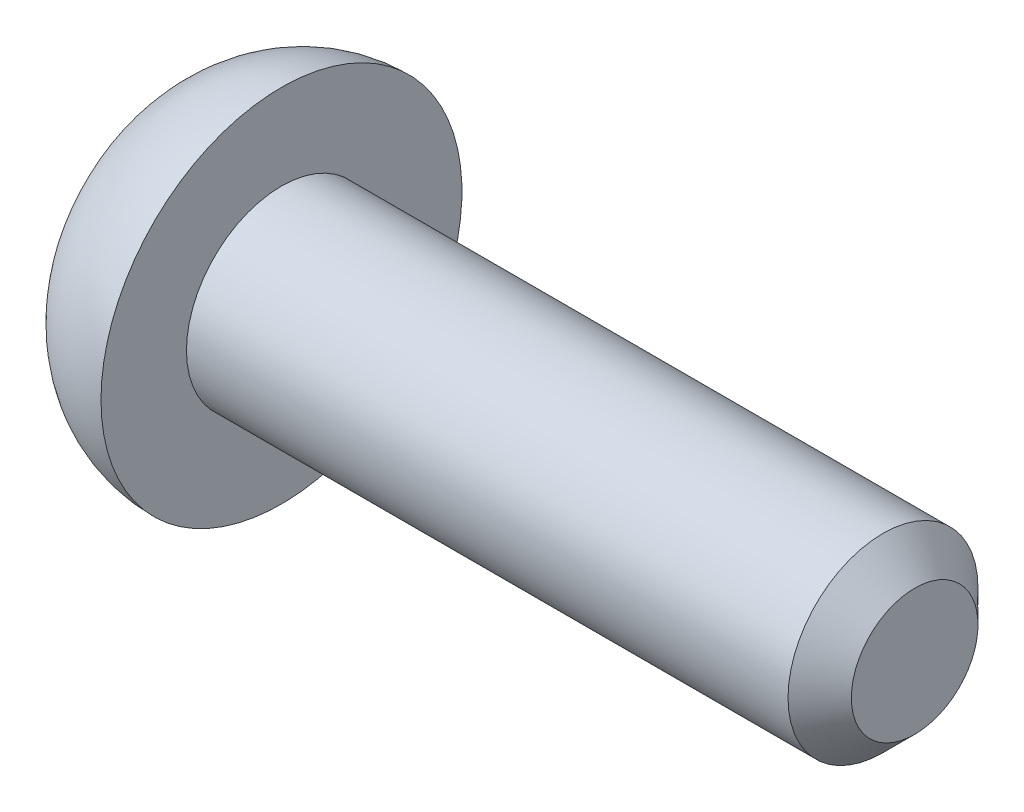
ISO-10303-21;
HEADER;
FILE_DESCRIPTION(('STEP AP214'),'2;1');
FILE_NAME('part.step','',(''),(''),'','','');
FILE_SCHEMA(('AUTOMOTIVE_DESIGN { 1 0 10303 214 1 1 1 1 }'));
ENDSEC;
DATA;
#1=APPLICATION_CONTEXT('core data for automotive mechanical design processes');
#2=APPLICATION_PROTOCOL_DEFINITION('international standard','automotive_design',2000,#1);
#3=PRODUCT_CONTEXT('',#1,'mechanical');
#4=PRODUCT('Part','Part','',(#3));
#5=PRODUCT_RELATED_PRODUCT_CATEGORY('part','',(#4));
#6=PRODUCT_DEFINITION_FORMATION('','',#4);
#7=PRODUCT_DEFINITION_CONTEXT('part definition',#1,'design');
#8=PRODUCT_DEFINITION('design','',#6,#7);
#9=PRODUCT_DEFINITION_SHAPE('','',#8);
#10=(LENGTH_UNIT() NAMED_UNIT(*) SI_UNIT(.MILLI.,.METRE.));
#11=(NAMED_UNIT(*) PLANE_ANGLE_UNIT() SI_UNIT($,.RADIAN.));
#12=(NAMED_UNIT(*) SI_UNIT($,.STERADIAN.) SOLID_ANGLE_UNIT());
#13=UNCERTAINTY_MEASURE_WITH_UNIT(LENGTH_MEASURE(1.E-05),#10,'distance_accuracy_value','');
#14=(GEOMETRIC_REPRESENTATION_CONTEXT(3) GLOBAL_UNCERTAINTY_ASSIGNED_CONTEXT((#13)) GLOBAL_UNIT_ASSIGNED_CONTEXT((#10,
#11,#12)) REPRESENTATION_CONTEXT('',''));
#15=CARTESIAN_POINT('',(0.,0.,0.));
#16=DIRECTION('',(0.,0.,1.));
#17=DIRECTION('',(1.,0.,0.));
#18=AXIS2_PLACEMENT_3D('',#15,#16,#17);
#19=CARTESIAN_POINT('',(-11.65,0.,-2.04903810567666));
#20=DIRECTION('',(1.,0.,0.));
#21=DIRECTION('',(0.,0.,-1.));
#22=AXIS2_PLACEMENT_3D('',#19,#20,#21);
#23=PLANE('',#22);
#24=CARTESIAN_POINT('',(-11.65,2.04903810567666,0.));
#25=DIRECTION('',(1.,0.,0.));
#26=DIRECTION('',(0.,0.,1.));
#27=AXIS2_PLACEMENT_3D('',#24,#25,#26);
#28=CIRCLE('',#27,1.02907378905691);
#29=CARTESIAN_POINT('',(-11.65,1.20759961003623,0.592430689092257));
#30=VERTEX_POINT('',#29);
#31=CARTESIAN_POINT('',(-11.65,1.20759961003623,-0.592430689092258));
#32=VERTEX_POINT('',#31);
#33=EDGE_CURVE('E157',#30,#32,#28,.T.);
#34=ORIENTED_EDGE('',*,*,#33,.F.);
#35=CARTESIAN_POINT('',(-11.65,1.12583302491977,0.650000000000001));
#36=DIRECTION('',(-1.,0.,0.));
#37=DIRECTION('',(0.,0.,1.));
#38=AXIS2_PLACEMENT_3D('',#35,#36,#37);
#39=CIRCLE('',#38,0.1);
#40=CARTESIAN_POINT('',(-11.65,1.11685983175353,0.74959659534543));
#41=VERTEX_POINT('',#40);
#42=EDGE_CURVE('E47',#41,#30,#39,.T.);
#43=ORIENTED_EDGE('',*,*,#42,.F.);
#44=CARTESIAN_POINT('',(-11.65,1.02451905283833,1.77451905283833));
#45=DIRECTION('',(1.,0.,0.));
#46=DIRECTION('',(0.,0.,1.));
#47=AXIS2_PLACEMENT_3D('',#44,#45,#46);
#48=CIRCLE('',#47,1.02907378905691);
#49=CARTESIAN_POINT('',(-11.65,0.0907397782827011,1.34202728443769));
#50=VERTEX_POINT('',#49);
#51=EDGE_CURVE('E184',#50,#41,#48,.T.);
#52=ORIENTED_EDGE('',*,*,#51,.F.);
#53=CARTESIAN_POINT('',(-11.65,0.,1.3));
#54=DIRECTION('',(-1.,0.,0.));
#55=DIRECTION('',(0.,0.,1.));
#56=AXIS2_PLACEMENT_3D('',#53,#54,#55);
#57=CIRCLE('',#56,0.1);
#58=CARTESIAN_POINT('',(-11.65,-0.0907397782827009,1.34202728443769));
#59=VERTEX_POINT('',#58);
#60=EDGE_CURVE('E182',#59,#50,#57,.T.);
#61=ORIENTED_EDGE('',*,*,#60,.F.);
#62=CARTESIAN_POINT('',(-11.65,-1.02451905283833,1.77451905283833));
#63=DIRECTION('',(1.,0.,0.));
#64=DIRECTION('',(0.,0.,1.));
#65=AXIS2_PLACEMENT_3D('',#62,#63,#64);
#66=CIRCLE('',#65,1.02907378905691);
#67=CARTESIAN_POINT('',(-11.65,-1.11685983175353,0.74959659534543));
#68=VERTEX_POINT('',#67);
#69=EDGE_CURVE('E131',#68,#59,#66,.T.);
#70=ORIENTED_EDGE('',*,*,#69,.F.);
#71=CARTESIAN_POINT('',(-11.65,-1.12583302491977,0.650000000000001));
#72=DIRECTION('',(-1.,0.,0.));
#73=DIRECTION('',(0.,0.,-1.));
#74=AXIS2_PLACEMENT_3D('',#71,#72,#73);
#75=CIRCLE('',#74,0.0999999999999997);
#76=CARTESIAN_POINT('',(-11.65,-1.20759961003623,0.592430689092258));
#77=VERTEX_POINT('',#76);
#78=EDGE_CURVE('E178',#77,#68,#75,.T.);
#79=ORIENTED_EDGE('',*,*,#78,.F.);
#80=CARTESIAN_POINT('',(-11.65,-2.04903810567666,0.));
#81=DIRECTION('',(1.,0.,0.));
#82=DIRECTION('',(0.,0.,-1.));
#83=AXIS2_PLACEMENT_3D('',#80,#81,#82);
#84=CIRCLE('',#83,1.02907378905691);
#85=CARTESIAN_POINT('',(-11.65,-1.20759961003623,-0.592430689092258));
#86=VERTEX_POINT('',#85);
#87=EDGE_CURVE('E175',#86,#77,#84,.T.);
#88=ORIENTED_EDGE('',*,*,#87,.F.);
#89=CARTESIAN_POINT('',(-11.65,-1.12583302491977,-0.650000000000001));
#90=DIRECTION('',(-1.,0.,0.));
#91=DIRECTION('',(0.,0.,1.));
#92=AXIS2_PLACEMENT_3D('',#89,#90,#91);
#93=CIRCLE('',#92,0.0999999999999999);
#94=CARTESIAN_POINT('',(-11.65,-1.11685983175353,-0.749596595345431));
#95=VERTEX_POINT('',#94);
#96=EDGE_CURVE('E172',#95,#86,#93,.T.);
#97=ORIENTED_EDGE('',*,*,#96,.F.);
#98=CARTESIAN_POINT('',(-11.65,-1.02451905283833,-1.77451905283833));
#99=DIRECTION('',(1.,0.,0.));
#100=DIRECTION('',(0.,0.,1.));
#101=AXIS2_PLACEMENT_3D('',#98,#99,#100);
#102=CIRCLE('',#101,1.02907378905691);
#103=CARTESIAN_POINT('',(-11.65,-0.0907397782827007,-1.34202728443769));
#104=VERTEX_POINT('',#103);
#105=EDGE_CURVE('E169',#104,#95,#102,.T.);
#106=ORIENTED_EDGE('',*,*,#105,.F.);
#107=CARTESIAN_POINT('',(-11.65,0.,-1.3));
#108=DIRECTION('',(-1.,0.,0.));
#109=DIRECTION('',(0.,0.,1.));
#110=AXIS2_PLACEMENT_3D('',#107,#108,#109);
#111=CIRCLE('',#110,0.1);
#112=CARTESIAN_POINT('',(-11.65,0.0907397782827007,-1.34202728443769));
#113=VERTEX_POINT('',#112);
#114=EDGE_CURVE('E166',#113,#104,#111,.T.);
#115=ORIENTED_EDGE('',*,*,#114,.F.);
#116=CARTESIAN_POINT('',(-11.65,1.02451905283833,-1.77451905283833));
#117=DIRECTION('',(1.,0.,0.));
#118=DIRECTION('',(0.,0.,1.));
#119=AXIS2_PLACEMENT_3D('',#116,#117,#118);
#120=CIRCLE('',#119,1.02907378905691);
#121=CARTESIAN_POINT('',(-11.65,1.11685983175353,-0.74959659534543));
#122=VERTEX_POINT('',#121);
#123=EDGE_CURVE('E163',#122,#113,#120,.T.);
#124=ORIENTED_EDGE('',*,*,#123,.F.);
#125=CARTESIAN_POINT('',(-11.65,1.12583302491977,-0.650000000000001));
#126=DIRECTION('',(-1.,0.,0.));
#127=DIRECTION('',(0.,0.,-1.));
#128=AXIS2_PLACEMENT_3D('',#125,#126,#127);
#129=CIRCLE('',#128,0.0999999999999998);
#130=EDGE_CURVE('E160',#32,#122,#129,.T.);
#131=ORIENTED_EDGE('',*,*,#130,.F.);
#132=EDGE_LOOP('',(#34,#43,#52,#61,#70,#79,#88,#97,#106,#115,#124,#131));
#133=FACE_BOUND('',#132,.T.);
#134=CARTESIAN_POINT('',(-11.65,0.,0.));
#135=DIRECTION('',(-1.,0.,0.));
#136=DIRECTION('',(0.,0.,1.));
#137=AXIS2_PLACEMENT_3D('',#134,#135,#136);
#138=CIRCLE('',#137,2.04903810567666);
#139=CARTESIAN_POINT('',(-11.65,0.,2.04903810567666));
#140=VERTEX_POINT('',#139);
#141=EDGE_CURVE('E211',#140,#140,#138,.T.);
#142=ORIENTED_EDGE('',*,*,#141,.T.);
#143=EDGE_LOOP('',(#142));
#144=FACE_BOUND('',#143,.T.);
#145=ADVANCED_FACE('F32',(#133,#144),#23,.F.);
#146=CARTESIAN_POINT('',(-10.,0.,0.));
#147=DIRECTION('',(-1.,0.,0.));
#148=DIRECTION('',(0.,0.,1.));
#149=AXIS2_PLACEMENT_3D('',#146,#147,#148);
#150=DEGENERATE_TOROIDAL_SURFACE('',#149,0.749999999999999,2.1,.T.);
#151=ORIENTED_EDGE('',*,*,#141,.F.);
#152=EDGE_LOOP('',(#151));
#153=FACE_BOUND('',#152,.T.);
#154=CARTESIAN_POINT('',(-10.,0.,0.));
#155=DIRECTION('',(-1.,0.,0.));
#156=DIRECTION('',(0.,0.,1.));
#157=AXIS2_PLACEMENT_3D('',#154,#155,#156);
#158=CIRCLE('',#157,2.85);
#159=CARTESIAN_POINT('',(-10.,0.,2.85));
#160=VERTEX_POINT('',#159);
#161=EDGE_CURVE('E208',#160,#160,#158,.T.);
#162=ORIENTED_EDGE('',*,*,#161,.T.);
#163=EDGE_LOOP('',(#162));
#164=FACE_BOUND('',#163,.T.);
#165=ADVANCED_FACE('F233',(#153,#164),#150,.T.);
#166=CARTESIAN_POINT('',(-10.,0.,-2.85));
#167=DIRECTION('',(-1.,0.,0.));
#168=DIRECTION('',(0.,0.,1.));
#169=AXIS2_PLACEMENT_3D('',#166,#167,#168);
#170=PLANE('',#169);
#171=ORIENTED_EDGE('',*,*,#161,.F.);
#172=EDGE_LOOP('',(#171));
#173=FACE_BOUND('',#172,.T.);
#174=CARTESIAN_POINT('',(-10.,0.,0.));
#175=DIRECTION('',(-1.,0.,0.));
#176=DIRECTION('',(0.,0.,1.));
#177=AXIS2_PLACEMENT_3D('',#174,#175,#176);
#178=CIRCLE('',#177,1.5);
#179=CARTESIAN_POINT('',(-10.,0.,1.5));
#180=VERTEX_POINT('',#179);
#181=EDGE_CURVE('E188',#180,#180,#178,.T.);
#182=ORIENTED_EDGE('',*,*,#181,.T.);
#183=EDGE_LOOP('',(#182));
#184=FACE_BOUND('',#183,.T.);
#185=ADVANCED_FACE('F238',(#173,#184),#170,.F.);
#186=CARTESIAN_POINT('',(-11.65,0.,0.));
#187=DIRECTION('',(-1.,0.,0.));
#188=DIRECTION('',(0.,0.,1.));
#189=AXIS2_PLACEMENT_3D('',#186,#187,#188);
#190=CYLINDRICAL_SURFACE('',#189,1.5);
#191=CARTESIAN_POINT('',(-0.500000000000002,0.,0.));
#192=DIRECTION('',(-1.,0.,0.));
#193=DIRECTION('',(0.,0.,1.));
#194=AXIS2_PLACEMENT_3D('',#191,#192,#193);
#195=CIRCLE('',#194,1.5);
#196=CARTESIAN_POINT('',(-0.500000000000002,0.,1.5));
#197=VERTEX_POINT('',#196);
#198=EDGE_CURVE('E40',#197,#197,#195,.T.);
#199=ORIENTED_EDGE('',*,*,#198,.T.);
#200=EDGE_LOOP('',(#199));
#201=FACE_BOUND('',#200,.T.);
#202=ORIENTED_EDGE('',*,*,#181,.F.);
#203=EDGE_LOOP('',(#202));
#204=FACE_BOUND('',#203,.T.);
#205=ADVANCED_FACE('F216',(#201,#204),#190,.T.);
#206=CARTESIAN_POINT('',(0.,0.,0.));
#207=DIRECTION('',(-1.,0.,0.));
#208=DIRECTION('',(0.,0.,1.));
#209=AXIS2_PLACEMENT_3D('',#206,#207,#208);
#210=PLANE('',#209);
#211=CARTESIAN_POINT('',(0.,0.,0.));
#212=DIRECTION('',(-1.,0.,0.));
#213=DIRECTION('',(0.,0.,1.));
#214=AXIS2_PLACEMENT_3D('',#211,#212,#213);
#215=CIRCLE('',#214,0.999999999999996);
#216=CARTESIAN_POINT('',(0.,0.,0.999999999999996));
#217=VERTEX_POINT('',#216);
#218=EDGE_CURVE('E11',#217,#217,#215,.F.);
#219=ORIENTED_EDGE('',*,*,#218,.T.);
#220=EDGE_LOOP('',(#219));
#221=FACE_BOUND('',#220,.T.);
#222=ADVANCED_FACE('F221',(#221),#210,.F.);
#223=CARTESIAN_POINT('',(-0.500000000000002,0.,0.));
#224=DIRECTION('',(-1.,0.,0.));
#225=DIRECTION('',(0.,0.,1.));
#226=AXIS2_PLACEMENT_3D('',#223,#224,#225);
#227=CONICAL_SURFACE('',#226,1.5,0.78539816339745);
#228=ORIENTED_EDGE('',*,*,#218,.F.);
#229=EDGE_LOOP('',(#228));
#230=FACE_BOUND('',#229,.T.);
#231=ORIENTED_EDGE('',*,*,#198,.F.);
#232=EDGE_LOOP('',(#231));
#233=FACE_BOUND('',#232,.T.);
#234=ADVANCED_FACE('F34',(#230,#233),#227,.T.);
#235=CARTESIAN_POINT('',(-10.65,1.12583302491977,0.650000000000001));
#236=DIRECTION('',(-1.,0.,0.));
#237=DIRECTION('',(0.,0.,1.));
#238=AXIS2_PLACEMENT_3D('',#235,#236,#237);
#239=CYLINDRICAL_SURFACE('',#238,0.1);
#240=ORIENTED_EDGE('',*,*,#42,.T.);
#241=DIRECTION('',(-1.,0.,0.));
#242=VECTOR('',#241,1.);
#243=CARTESIAN_POINT('',(-10.65,1.20759961003623,0.592430689092257));
#244=LINE('',#243,#242);
#245=CARTESIAN_POINT('',(-10.65,1.20759961003623,0.592430689092257));
#246=VERTEX_POINT('',#245);
#247=EDGE_CURVE('E95',#246,#30,#244,.T.);
#248=ORIENTED_EDGE('',*,*,#247,.F.);
#249=CARTESIAN_POINT('',(-10.65,1.12583302491977,0.650000000000001));
#250=DIRECTION('',(-1.,0.,0.));
#251=DIRECTION('',(0.,0.,1.));
#252=AXIS2_PLACEMENT_3D('',#249,#250,#251);
#253=CIRCLE('',#252,0.1);
#254=CARTESIAN_POINT('',(-10.65,1.11685983175353,0.74959659534543));
#255=VERTEX_POINT('',#254);
#256=EDGE_CURVE('E186',#255,#246,#253,.T.);
#257=ORIENTED_EDGE('',*,*,#256,.F.);
#258=DIRECTION('',(-1.,0.,0.));
#259=VECTOR('',#258,1.);
#260=CARTESIAN_POINT('',(-10.65,1.11685983175353,0.74959659534543));
#261=LINE('',#260,#259);
#262=EDGE_CURVE('E55',#255,#41,#261,.T.);
#263=ORIENTED_EDGE('',*,*,#262,.T.);
#264=EDGE_LOOP('',(#240,#248,#257,#263));
#265=FACE_BOUND('',#264,.T.);
#266=ADVANCED_FACE('F220',(#265),#239,.F.);
#267=CARTESIAN_POINT('',(-10.65,1.02451905283833,1.77451905283833));
#268=DIRECTION('',(-1.,0.,0.));
#269=DIRECTION('',(0.,0.,1.));
#270=AXIS2_PLACEMENT_3D('',#267,#268,#269);
#271=CYLINDRICAL_SURFACE('',#270,1.02907378905691);
#272=ORIENTED_EDGE('',*,*,#51,.T.);
#273=ORIENTED_EDGE('',*,*,#262,.F.);
#274=CARTESIAN_POINT('',(-10.65,1.02451905283833,1.77451905283833));
#275=DIRECTION('',(1.,0.,0.));
#276=DIRECTION('',(0.,0.,1.));
#277=AXIS2_PLACEMENT_3D('',#274,#275,#276);
#278=CIRCLE('',#277,1.02907378905691);
#279=CARTESIAN_POINT('',(-10.65,0.0907397782827011,1.34202728443769));
#280=VERTEX_POINT('',#279);
#281=EDGE_CURVE('E143',#280,#255,#278,.T.);
#282=ORIENTED_EDGE('',*,*,#281,.F.);
#283=DIRECTION('',(-1.,0.,0.));
#284=VECTOR('',#283,1.);
#285=CARTESIAN_POINT('',(-10.65,0.0907397782827011,1.34202728443769));
#286=LINE('',#285,#284);
#287=EDGE_CURVE('E135',#280,#50,#286,.T.);
#288=ORIENTED_EDGE('',*,*,#287,.T.);
#289=EDGE_LOOP('',(#272,#273,#282,#288));
#290=FACE_BOUND('',#289,.T.);
#291=ADVANCED_FACE('F227',(#290),#271,.T.);
#292=CARTESIAN_POINT('',(-10.65,0.,1.3));
#293=DIRECTION('',(-1.,0.,0.));
#294=DIRECTION('',(0.,0.,1.));
#295=AXIS2_PLACEMENT_3D('',#292,#293,#294);
#296=CYLINDRICAL_SURFACE('',#295,0.1);
#297=ORIENTED_EDGE('',*,*,#60,.T.);
#298=ORIENTED_EDGE('',*,*,#287,.F.);
#299=CARTESIAN_POINT('',(-10.65,0.,1.3));
#300=DIRECTION('',(-1.,0.,0.));
#301=DIRECTION('',(0.,0.,1.));
#302=AXIS2_PLACEMENT_3D('',#299,#300,#301);
#303=CIRCLE('',#302,0.1);
#304=CARTESIAN_POINT('',(-10.65,-0.0907397782827009,1.34202728443769));
#305=VERTEX_POINT('',#304);
#306=EDGE_CURVE('E139',#305,#280,#303,.T.);
#307=ORIENTED_EDGE('',*,*,#306,.F.);
#308=DIRECTION('',(-1.,0.,0.));
#309=VECTOR('',#308,1.);
#310=CARTESIAN_POINT('',(-10.65,-0.0907397782827009,1.34202728443769));
#311=LINE('',#310,#309);
#312=EDGE_CURVE('E124',#305,#59,#311,.T.);
#313=ORIENTED_EDGE('',*,*,#312,.T.);
#314=EDGE_LOOP('',(#297,#298,#307,#313));
#315=FACE_BOUND('',#314,.T.);
#316=ADVANCED_FACE('F140',(#315),#296,.F.);
#317=CARTESIAN_POINT('',(-10.65,-1.02451905283833,1.77451905283833));
#318=DIRECTION('',(-1.,0.,0.));
#319=DIRECTION('',(0.,0.,1.));
#320=AXIS2_PLACEMENT_3D('',#317,#318,#319);
#321=CYLINDRICAL_SURFACE('',#320,1.02907378905691);
#322=ORIENTED_EDGE('',*,*,#69,.T.);
#323=ORIENTED_EDGE('',*,*,#312,.F.);
#324=CARTESIAN_POINT('',(-10.65,-1.02451905283833,1.77451905283833));
#325=DIRECTION('',(1.,0.,0.));
#326=DIRECTION('',(0.,0.,1.));
#327=AXIS2_PLACEMENT_3D('',#324,#325,#326);
#328=CIRCLE('',#327,1.02907378905691);
#329=CARTESIAN_POINT('',(-10.65,-1.11685983175353,0.74959659534543));
#330=VERTEX_POINT('',#329);
#331=EDGE_CURVE('E128',#330,#305,#328,.T.);
#332=ORIENTED_EDGE('',*,*,#331,.F.);
#333=DIRECTION('',(-1.,0.,0.));
#334=VECTOR('',#333,1.);
#335=CARTESIAN_POINT('',(-10.65,-1.11685983175353,0.74959659534543));
#336=LINE('',#335,#334);
#337=EDGE_CURVE('E136',#330,#68,#336,.T.);
#338=ORIENTED_EDGE('',*,*,#337,.T.);
#339=EDGE_LOOP('',(#322,#323,#332,#338));
#340=FACE_BOUND('',#339,.T.);
#341=ADVANCED_FACE('F126',(#340),#321,.T.);
#342=CARTESIAN_POINT('',(-10.65,-1.12583302491977,0.650000000000001));
#343=DIRECTION('',(-1.,0.,0.));
#344=DIRECTION('',(0.,0.,1.));
#345=AXIS2_PLACEMENT_3D('',#342,#343,#344);
#346=CYLINDRICAL_SURFACE('',#345,0.0999999999999997);
#347=ORIENTED_EDGE('',*,*,#78,.T.);
#348=ORIENTED_EDGE('',*,*,#337,.F.);
#349=CARTESIAN_POINT('',(-10.65,-1.12583302491977,0.650000000000001));
#350=DIRECTION('',(-1.,0.,0.));
#351=DIRECTION('',(0.,0.,-1.));
#352=AXIS2_PLACEMENT_3D('',#349,#350,#351);
#353=CIRCLE('',#352,0.0999999999999997);
#354=CARTESIAN_POINT('',(-10.65,-1.20759961003623,0.592430689092258));
#355=VERTEX_POINT('',#354);
#356=EDGE_CURVE('E149',#355,#330,#353,.T.);
#357=ORIENTED_EDGE('',*,*,#356,.F.);
#358=DIRECTION('',(-1.,0.,0.));
#359=VECTOR('',#358,1.);
#360=CARTESIAN_POINT('',(-10.65,-1.20759961003623,0.592430689092258));
#361=LINE('',#360,#359);
#362=EDGE_CURVE('E191',#355,#77,#361,.T.);
#363=ORIENTED_EDGE('',*,*,#362,.T.);
#364=EDGE_LOOP('',(#347,#348,#357,#363));
#365=FACE_BOUND('',#364,.T.);
#366=ADVANCED_FACE('F276',(#365),#346,.F.);
#367=CARTESIAN_POINT('',(-10.65,-2.04903810567666,0.));
#368=DIRECTION('',(-1.,0.,0.));
#369=DIRECTION('',(0.,0.,1.));
#370=AXIS2_PLACEMENT_3D('',#367,#368,#369);
#371=CYLINDRICAL_SURFACE('',#370,1.02907378905691);
#372=ORIENTED_EDGE('',*,*,#87,.T.);
#373=ORIENTED_EDGE('',*,*,#362,.F.);
#374=CARTESIAN_POINT('',(-10.65,-2.04903810567666,0.));
#375=DIRECTION('',(1.,0.,0.));
#376=DIRECTION('',(0.,0.,-1.));
#377=AXIS2_PLACEMENT_3D('',#374,#375,#376);
#378=CIRCLE('',#377,1.02907378905691);
#379=CARTESIAN_POINT('',(-10.65,-1.20759961003623,-0.592430689092258));
#380=VERTEX_POINT('',#379);
#381=EDGE_CURVE('E151',#380,#355,#378,.T.);
#382=ORIENTED_EDGE('',*,*,#381,.F.);
#383=DIRECTION('',(-1.,0.,0.));
#384=VECTOR('',#383,1.);
#385=CARTESIAN_POINT('',(-10.65,-1.20759961003623,-0.592430689092258));
#386=LINE('',#385,#384);
#387=EDGE_CURVE('E193',#380,#86,#386,.T.);
#388=ORIENTED_EDGE('',*,*,#387,.T.);
#389=EDGE_LOOP('',(#372,#373,#382,#388));
#390=FACE_BOUND('',#389,.T.);
#391=ADVANCED_FACE('F272',(#390),#371,.T.);
#392=CARTESIAN_POINT('',(-10.65,-1.12583302491977,-0.650000000000001));
#393=DIRECTION('',(-1.,0.,0.));
#394=DIRECTION('',(0.,0.,1.));
#395=AXIS2_PLACEMENT_3D('',#392,#393,#394);
#396=CYLINDRICAL_SURFACE('',#395,0.0999999999999999);
#397=ORIENTED_EDGE('',*,*,#96,.T.);
#398=ORIENTED_EDGE('',*,*,#387,.F.);
#399=CARTESIAN_POINT('',(-10.65,-1.12583302491977,-0.650000000000001));
#400=DIRECTION('',(-1.,0.,0.));
#401=DIRECTION('',(0.,0.,1.));
#402=AXIS2_PLACEMENT_3D('',#399,#400,#401);
#403=CIRCLE('',#402,0.0999999999999999);
#404=CARTESIAN_POINT('',(-10.65,-1.11685983175353,-0.749596595345431));
#405=VERTEX_POINT('',#404);
#406=EDGE_CURVE('E419',#405,#380,#403,.T.);
#407=ORIENTED_EDGE('',*,*,#406,.F.);
#408=DIRECTION('',(-1.,0.,0.));
#409=VECTOR('',#408,1.);
#410=CARTESIAN_POINT('',(-10.65,-1.11685983175353,-0.749596595345431));
#411=LINE('',#410,#409);
#412=EDGE_CURVE('E195',#405,#95,#411,.T.);
#413=ORIENTED_EDGE('',*,*,#412,.T.);
#414=EDGE_LOOP('',(#397,#398,#407,#413));
#415=FACE_BOUND('',#414,.T.);
#416=ADVANCED_FACE('F268',(#415),#396,.F.);
#417=CARTESIAN_POINT('',(-10.65,-1.02451905283833,-1.77451905283833));
#418=DIRECTION('',(-1.,0.,0.));
#419=DIRECTION('',(0.,0.,1.));
#420=AXIS2_PLACEMENT_3D('',#417,#418,#419);
#421=CYLINDRICAL_SURFACE('',#420,1.02907378905691);
#422=ORIENTED_EDGE('',*,*,#105,.T.);
#423=ORIENTED_EDGE('',*,*,#412,.F.);
#424=CARTESIAN_POINT('',(-10.65,-1.02451905283833,-1.77451905283833));
#425=DIRECTION('',(1.,0.,0.));
#426=DIRECTION('',(0.,0.,1.));
#427=AXIS2_PLACEMENT_3D('',#424,#425,#426);
#428=CIRCLE('',#427,1.02907378905691);
#429=CARTESIAN_POINT('',(-10.65,-0.0907397782827007,-1.34202728443769));
#430=VERTEX_POINT('',#429);
#431=EDGE_CURVE('E416',#430,#405,#428,.T.);
#432=ORIENTED_EDGE('',*,*,#431,.F.);
#433=DIRECTION('',(-1.,0.,0.));
#434=VECTOR('',#433,1.);
#435=CARTESIAN_POINT('',(-10.65,-0.0907397782827007,-1.34202728443769));
#436=LINE('',#435,#434);
#437=EDGE_CURVE('E197',#430,#104,#436,.T.);
#438=ORIENTED_EDGE('',*,*,#437,.T.);
#439=EDGE_LOOP('',(#422,#423,#432,#438));
#440=FACE_BOUND('',#439,.T.);
#441=ADVANCED_FACE('F264',(#440),#421,.T.);
#442=CARTESIAN_POINT('',(-10.65,0.,-1.3));
#443=DIRECTION('',(-1.,0.,0.));
#444=DIRECTION('',(0.,0.,1.));
#445=AXIS2_PLACEMENT_3D('',#442,#443,#444);
#446=CYLINDRICAL_SURFACE('',#445,0.1);
#447=ORIENTED_EDGE('',*,*,#114,.T.);
#448=ORIENTED_EDGE('',*,*,#437,.F.);
#449=CARTESIAN_POINT('',(-10.65,0.,-1.3));
#450=DIRECTION('',(-1.,0.,0.));
#451=DIRECTION('',(0.,0.,1.));
#452=AXIS2_PLACEMENT_3D('',#449,#450,#451);
#453=CIRCLE('',#452,0.1);
#454=CARTESIAN_POINT('',(-10.65,0.0907397782827007,-1.34202728443769));
#455=VERTEX_POINT('',#454);
#456=EDGE_CURVE('E413',#455,#430,#453,.T.);
#457=ORIENTED_EDGE('',*,*,#456,.F.);
#458=DIRECTION('',(-1.,0.,0.));
#459=VECTOR('',#458,1.);
#460=CARTESIAN_POINT('',(-10.65,0.0907397782827007,-1.34202728443769));
#461=LINE('',#460,#459);
#462=EDGE_CURVE('E199',#455,#113,#461,.T.);
#463=ORIENTED_EDGE('',*,*,#462,.T.);
#464=EDGE_LOOP('',(#447,#448,#457,#463));
#465=FACE_BOUND('',#464,.T.);
#466=ADVANCED_FACE('F260',(#465),#446,.F.);
#467=CARTESIAN_POINT('',(-10.65,1.02451905283833,-1.77451905283833));
#468=DIRECTION('',(-1.,0.,0.));
#469=DIRECTION('',(0.,0.,1.));
#470=AXIS2_PLACEMENT_3D('',#467,#468,#469);
#471=CYLINDRICAL_SURFACE('',#470,1.02907378905691);
#472=ORIENTED_EDGE('',*,*,#123,.T.);
#473=ORIENTED_EDGE('',*,*,#462,.F.);
#474=CARTESIAN_POINT('',(-10.65,1.02451905283833,-1.77451905283833));
#475=DIRECTION('',(1.,0.,0.));
#476=DIRECTION('',(0.,0.,1.));
#477=AXIS2_PLACEMENT_3D('',#474,#475,#476);
#478=CIRCLE('',#477,1.02907378905691);
#479=CARTESIAN_POINT('',(-10.65,1.11685983175353,-0.74959659534543));
#480=VERTEX_POINT('',#479);
#481=EDGE_CURVE('E410',#480,#455,#478,.T.);
#482=ORIENTED_EDGE('',*,*,#481,.F.);
#483=DIRECTION('',(-1.,0.,0.));
#484=VECTOR('',#483,1.);
#485=CARTESIAN_POINT('',(-10.65,1.11685983175353,-0.74959659534543));
#486=LINE('',#485,#484);
#487=EDGE_CURVE('E201',#480,#122,#486,.T.);
#488=ORIENTED_EDGE('',*,*,#487,.T.);
#489=EDGE_LOOP('',(#472,#473,#482,#488));
#490=FACE_BOUND('',#489,.T.);
#491=ADVANCED_FACE('F256',(#490),#471,.T.);
#492=CARTESIAN_POINT('',(-10.65,1.12583302491977,-0.650000000000001));
#493=DIRECTION('',(-1.,0.,0.));
#494=DIRECTION('',(0.,0.,1.));
#495=AXIS2_PLACEMENT_3D('',#492,#493,#494);
#496=CYLINDRICAL_SURFACE('',#495,0.0999999999999998);
#497=ORIENTED_EDGE('',*,*,#130,.T.);
#498=ORIENTED_EDGE('',*,*,#487,.F.);
#499=CARTESIAN_POINT('',(-10.65,1.12583302491977,-0.650000000000001));
#500=DIRECTION('',(-1.,0.,0.));
#501=DIRECTION('',(0.,0.,-1.));
#502=AXIS2_PLACEMENT_3D('',#499,#500,#501);
#503=CIRCLE('',#502,0.0999999999999998);
#504=CARTESIAN_POINT('',(-10.65,1.20759961003623,-0.592430689092258));
#505=VERTEX_POINT('',#504);
#506=EDGE_CURVE('E405',#505,#480,#503,.T.);
#507=ORIENTED_EDGE('',*,*,#506,.F.);
#508=DIRECTION('',(-1.,0.,0.));
#509=VECTOR('',#508,1.);
#510=CARTESIAN_POINT('',(-10.65,1.20759961003623,-0.592430689092258));
#511=LINE('',#510,#509);
#512=EDGE_CURVE('E203',#505,#32,#511,.T.);
#513=ORIENTED_EDGE('',*,*,#512,.T.);
#514=EDGE_LOOP('',(#497,#498,#507,#513));
#515=FACE_BOUND('',#514,.T.);
#516=ADVANCED_FACE('F252',(#515),#496,.F.);
#517=CARTESIAN_POINT('',(-10.65,2.04903810567666,0.));
#518=DIRECTION('',(-1.,0.,0.));
#519=DIRECTION('',(0.,0.,1.));
#520=AXIS2_PLACEMENT_3D('',#517,#518,#519);
#521=CYLINDRICAL_SURFACE('',#520,1.02907378905691);
#522=ORIENTED_EDGE('',*,*,#33,.T.);
#523=ORIENTED_EDGE('',*,*,#512,.F.);
#524=CARTESIAN_POINT('',(-10.65,2.04903810567666,0.));
#525=DIRECTION('',(1.,0.,0.));
#526=DIRECTION('',(0.,0.,1.));
#527=AXIS2_PLACEMENT_3D('',#524,#525,#526);
#528=CIRCLE('',#527,1.02907378905691);
#529=EDGE_CURVE('E403',#246,#505,#528,.T.);
#530=ORIENTED_EDGE('',*,*,#529,.F.);
#531=ORIENTED_EDGE('',*,*,#247,.T.);
#532=EDGE_LOOP('',(#522,#523,#530,#531));
#533=FACE_BOUND('',#532,.T.);
#534=ADVANCED_FACE('F249',(#533),#521,.T.);
#535=CARTESIAN_POINT('',(-10.65,1.58743556529821,0.325));
#536=DIRECTION('',(-1.,0.,0.));
#537=DIRECTION('',(0.,0.,1.));
#538=AXIS2_PLACEMENT_3D('',#535,#536,#537);
#539=PLANE('',#538);
#540=ORIENTED_EDGE('',*,*,#256,.T.);
#541=ORIENTED_EDGE('',*,*,#529,.T.);
#542=ORIENTED_EDGE('',*,*,#506,.T.);
#543=ORIENTED_EDGE('',*,*,#481,.T.);
#544=ORIENTED_EDGE('',*,*,#456,.T.);
#545=ORIENTED_EDGE('',*,*,#431,.T.);
#546=ORIENTED_EDGE('',*,*,#406,.T.);
#547=ORIENTED_EDGE('',*,*,#381,.T.);
#548=ORIENTED_EDGE('',*,*,#356,.T.);
#549=ORIENTED_EDGE('',*,*,#331,.T.);
#550=ORIENTED_EDGE('',*,*,#306,.T.);
#551=ORIENTED_EDGE('',*,*,#281,.T.);
#552=EDGE_LOOP('',(#540,#541,#542,#543,#544,#545,#546,#547,#548,#549,#550,#551));
#553=FACE_BOUND('',#552,.T.);
#554=ADVANCED_FACE('F146',(#553),#539,.T.);
#555=CLOSED_SHELL('',(#145,#165,#185,#205,#222,#234,#266,#291,#316,#341,#366,#391,#416,#441,
#466,#491,#516,#534,#554));
#556=MANIFOLD_SOLID_BREP('B2',#555);
#557=ADVANCED_BREP_SHAPE_REPRESENTATION('',(#18,#556),#14);
#558=SHAPE_DEFINITION_REPRESENTATION(#9,#557);
ENDSEC;
END-ISO-10303-21;
